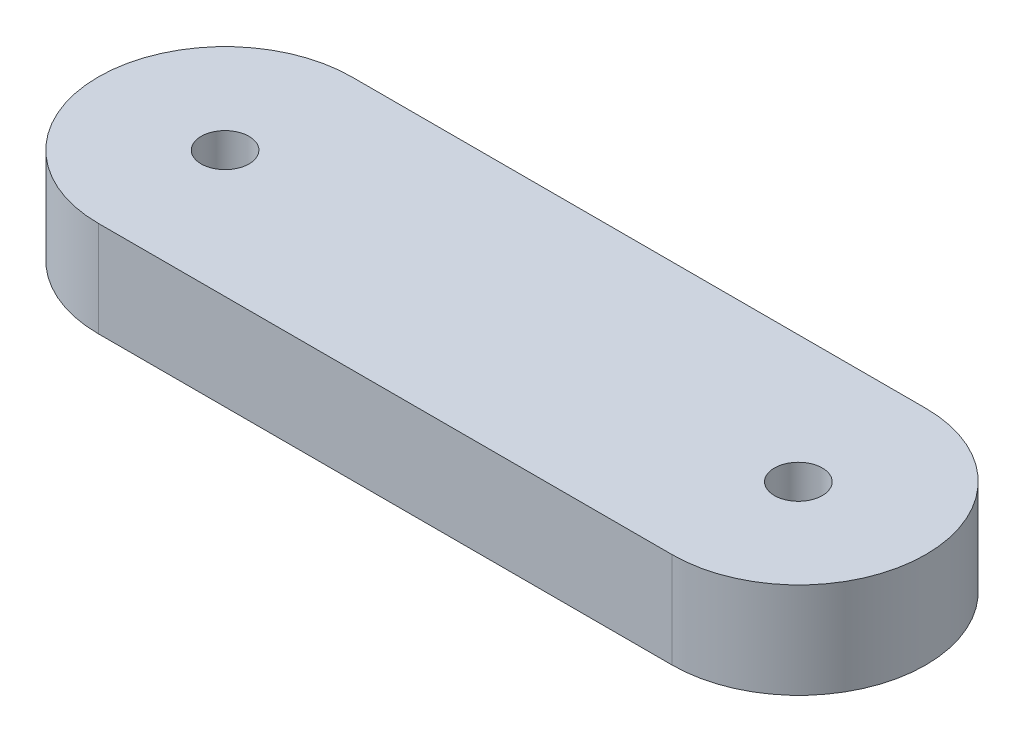
ISO-10303-21;
HEADER;
FILE_DESCRIPTION(('STEP AP214'),'2;1');
FILE_NAME('part.step','',(''),(''),'','','');
FILE_SCHEMA(('AUTOMOTIVE_DESIGN { 1 0 10303 214 1 1 1 1 }'));
ENDSEC;
DATA;
#1=APPLICATION_CONTEXT('core data for automotive mechanical design processes');
#2=APPLICATION_PROTOCOL_DEFINITION('international standard','automotive_design',2000,#1);
#3=PRODUCT_CONTEXT('',#1,'mechanical');
#4=PRODUCT('Part','Part','',(#3));
#5=PRODUCT_RELATED_PRODUCT_CATEGORY('part','',(#4));
#6=PRODUCT_DEFINITION_FORMATION('','',#4);
#7=PRODUCT_DEFINITION_CONTEXT('part definition',#1,'design');
#8=PRODUCT_DEFINITION('design','',#6,#7);
#9=PRODUCT_DEFINITION_SHAPE('','',#8);
#10=(LENGTH_UNIT() NAMED_UNIT(*) SI_UNIT(.MILLI.,.METRE.));
#11=(NAMED_UNIT(*) PLANE_ANGLE_UNIT() SI_UNIT($,.RADIAN.));
#12=(NAMED_UNIT(*) SI_UNIT($,.STERADIAN.) SOLID_ANGLE_UNIT());
#13=UNCERTAINTY_MEASURE_WITH_UNIT(LENGTH_MEASURE(1.E-05),#10,'distance_accuracy_value','');
#14=(GEOMETRIC_REPRESENTATION_CONTEXT(3) GLOBAL_UNCERTAINTY_ASSIGNED_CONTEXT((#13)) GLOBAL_UNIT_ASSIGNED_CONTEXT((#10,
#11,#12)) REPRESENTATION_CONTEXT('',''));
#15=CARTESIAN_POINT('',(0.,0.,0.));
#16=DIRECTION('',(0.,0.,1.));
#17=DIRECTION('',(1.,0.,0.));
#18=AXIS2_PLACEMENT_3D('',#15,#16,#17);
#19=CARTESIAN_POINT('',(-16.4088519542022,6.,6.09914337868322));
#20=DIRECTION('',(0.,1.,0.));
#21=DIRECTION('',(0.,0.,1.));
#22=AXIS2_PLACEMENT_3D('',#19,#20,#21);
#23=PLANE('',#22);
#24=CARTESIAN_POINT('',(19.5911296930118,6.,6.13549444815868));
#25=DIRECTION('',(0.,1.,0.));
#26=DIRECTION('',(0.,0.,1.));
#27=AXIS2_PLACEMENT_3D('',#24,#25,#26);
#28=CIRCLE('',#27,1.50185606528052);
#29=CARTESIAN_POINT('',(19.5911296930118,6.,7.6373505134392));
#30=VERTEX_POINT('',#29);
#31=EDGE_CURVE('E102',#30,#30,#28,.T.);
#32=ORIENTED_EDGE('',*,*,#31,.F.);
#33=EDGE_LOOP('',(#32));
#34=FACE_BOUND('',#33,.T.);
#35=CARTESIAN_POINT('',(-16.4088519542022,6.,6.09914337868322));
#36=DIRECTION('',(0.,1.,0.));
#37=DIRECTION('',(0.,0.,1.));
#38=AXIS2_PLACEMENT_3D('',#35,#36,#37);
#39=CIRCLE('',#38,7.95432054276186);
#40=CARTESIAN_POINT('',(-16.4088519542022,6.,-1.85517716407875));
#41=VERTEX_POINT('',#40);
#42=CARTESIAN_POINT('',(-16.4088519542022,6.,14.053463921445));
#43=VERTEX_POINT('',#42);
#44=EDGE_CURVE('E87',#41,#43,#39,.T.);
#45=ORIENTED_EDGE('',*,*,#44,.T.);
#46=DIRECTION('',(1.,0.,0.));
#47=VECTOR('',#46,1.);
#48=CARTESIAN_POINT('',(-16.4088519542022,6.,14.053463921445));
#49=LINE('',#48,#47);
#50=CARTESIAN_POINT('',(19.5911480447954,6.,14.053463921445));
#51=VERTEX_POINT('',#50);
#52=EDGE_CURVE('E82',#43,#51,#49,.T.);
#53=ORIENTED_EDGE('',*,*,#52,.T.);
#54=CARTESIAN_POINT('',(19.5911480447954,6.,6.09927770648704));
#55=DIRECTION('',(0.,1.,0.));
#56=DIRECTION('',(0.,0.,1.));
#57=AXIS2_PLACEMENT_3D('',#54,#55,#56);
#58=CIRCLE('',#57,7.95418621495793);
#59=CARTESIAN_POINT('',(19.5911480447954,6.,-1.85490850847089));
#60=VERTEX_POINT('',#59);
#61=EDGE_CURVE('E85',#51,#60,#58,.T.);
#62=ORIENTED_EDGE('',*,*,#61,.T.);
#63=DIRECTION('',(-0.999999999972154,0.,-7.46265577382822E-06));
#64=VECTOR('',#63,1.);
#65=CARTESIAN_POINT('',(-16.4088519542022,6.,-1.85517716407875));
#66=LINE('',#65,#64);
#67=EDGE_CURVE('E52',#60,#41,#66,.T.);
#68=ORIENTED_EDGE('',*,*,#67,.T.);
#69=EDGE_LOOP('',(#45,#53,#62,#68));
#70=FACE_BOUND('',#69,.T.);
#71=CARTESIAN_POINT('',(-16.4088519542022,6.,6.09914337868322));
#72=DIRECTION('',(0.,1.,0.));
#73=DIRECTION('',(0.,0.,1.));
#74=AXIS2_PLACEMENT_3D('',#71,#72,#73);
#75=CIRCLE('',#74,1.50185606528058);
#76=CARTESIAN_POINT('',(-16.4088519542022,6.,7.6009994439638));
#77=VERTEX_POINT('',#76);
#78=EDGE_CURVE('E117',#77,#77,#75,.T.);
#79=ORIENTED_EDGE('',*,*,#78,.F.);
#80=EDGE_LOOP('',(#79));
#81=FACE_BOUND('',#80,.T.);
#82=ADVANCED_FACE('F35',(#34,#70,#81),#23,.T.);
#83=CARTESIAN_POINT('',(-16.4088519542022,0.,6.09914337868322));
#84=DIRECTION('',(0.,1.,0.));
#85=DIRECTION('',(0.,0.,1.));
#86=AXIS2_PLACEMENT_3D('',#83,#84,#85);
#87=PLANE('',#86);
#88=CARTESIAN_POINT('',(-16.4088519542022,0.,6.09914337868322));
#89=DIRECTION('',(0.,1.,0.));
#90=DIRECTION('',(0.,0.,1.));
#91=AXIS2_PLACEMENT_3D('',#88,#89,#90);
#92=CIRCLE('',#91,7.95432054276186);
#93=CARTESIAN_POINT('',(-16.4088519542022,0.,-1.85517716407875));
#94=VERTEX_POINT('',#93);
#95=CARTESIAN_POINT('',(-16.4088519542022,0.,14.053463921445));
#96=VERTEX_POINT('',#95);
#97=EDGE_CURVE('E99',#94,#96,#92,.T.);
#98=ORIENTED_EDGE('',*,*,#97,.F.);
#99=DIRECTION('',(-0.999999999972154,0.,-7.46265577382822E-06));
#100=VECTOR('',#99,1.);
#101=CARTESIAN_POINT('',(-16.4088519542022,0.,-1.85517716407875));
#102=LINE('',#101,#100);
#103=CARTESIAN_POINT('',(19.5911480447954,0.,-1.85490850847089));
#104=VERTEX_POINT('',#103);
#105=EDGE_CURVE('E75',#104,#94,#102,.T.);
#106=ORIENTED_EDGE('',*,*,#105,.F.);
#107=CARTESIAN_POINT('',(19.5911480447954,0.,6.09927770648704));
#108=DIRECTION('',(0.,1.,0.));
#109=DIRECTION('',(0.,0.,1.));
#110=AXIS2_PLACEMENT_3D('',#107,#108,#109);
#111=CIRCLE('',#110,7.95418621495793);
#112=CARTESIAN_POINT('',(19.5911480447954,0.,14.053463921445));
#113=VERTEX_POINT('',#112);
#114=EDGE_CURVE('E69',#113,#104,#111,.T.);
#115=ORIENTED_EDGE('',*,*,#114,.F.);
#116=DIRECTION('',(1.,0.,0.));
#117=VECTOR('',#116,1.);
#118=CARTESIAN_POINT('',(-16.4088519542022,0.,14.053463921445));
#119=LINE('',#118,#117);
#120=EDGE_CURVE('E91',#96,#113,#119,.T.);
#121=ORIENTED_EDGE('',*,*,#120,.F.);
#122=EDGE_LOOP('',(#98,#106,#115,#121));
#123=FACE_BOUND('',#122,.T.);
#124=CARTESIAN_POINT('',(19.5911296930118,0.,6.13549444815868));
#125=DIRECTION('',(0.,1.,0.));
#126=DIRECTION('',(0.,0.,1.));
#127=AXIS2_PLACEMENT_3D('',#124,#125,#126);
#128=CIRCLE('',#127,1.50185606528052);
#129=CARTESIAN_POINT('',(19.5911296930118,0.,7.6373505134392));
#130=VERTEX_POINT('',#129);
#131=EDGE_CURVE('E114',#130,#130,#128,.T.);
#132=ORIENTED_EDGE('',*,*,#131,.T.);
#133=EDGE_LOOP('',(#132));
#134=FACE_BOUND('',#133,.T.);
#135=CARTESIAN_POINT('',(-16.4088519542022,0.,6.09914337868322));
#136=DIRECTION('',(0.,1.,0.));
#137=DIRECTION('',(0.,0.,1.));
#138=AXIS2_PLACEMENT_3D('',#135,#136,#137);
#139=CIRCLE('',#138,1.50185606528058);
#140=CARTESIAN_POINT('',(-16.4088519542022,0.,7.6009994439638));
#141=VERTEX_POINT('',#140);
#142=EDGE_CURVE('E120',#141,#141,#139,.T.);
#143=ORIENTED_EDGE('',*,*,#142,.T.);
#144=EDGE_LOOP('',(#143));
#145=FACE_BOUND('',#144,.T.);
#146=ADVANCED_FACE('F110',(#123,#134,#145),#87,.F.);
#147=CARTESIAN_POINT('',(-16.4088519542022,6.,6.09914337868322));
#148=DIRECTION('',(0.,-1.,0.));
#149=DIRECTION('',(0.,0.,-1.));
#150=AXIS2_PLACEMENT_3D('',#147,#148,#149);
#151=CYLINDRICAL_SURFACE('',#150,7.95432054276186);
#152=ORIENTED_EDGE('',*,*,#97,.T.);
#153=DIRECTION('',(0.,-1.,0.));
#154=VECTOR('',#153,1.);
#155=CARTESIAN_POINT('',(-16.4088519542022,6.,14.053463921445));
#156=LINE('',#155,#154);
#157=EDGE_CURVE('E11',#43,#96,#156,.T.);
#158=ORIENTED_EDGE('',*,*,#157,.F.);
#159=ORIENTED_EDGE('',*,*,#44,.F.);
#160=DIRECTION('',(0.,-1.,0.));
#161=VECTOR('',#160,1.);
#162=CARTESIAN_POINT('',(-16.4088519542022,6.,-1.85517716407875));
#163=LINE('',#162,#161);
#164=EDGE_CURVE('E95',#41,#94,#163,.T.);
#165=ORIENTED_EDGE('',*,*,#164,.T.);
#166=EDGE_LOOP('',(#152,#158,#159,#165));
#167=FACE_BOUND('',#166,.T.);
#168=ADVANCED_FACE('F37',(#167),#151,.T.);
#169=CARTESIAN_POINT('',(-16.4088519542022,6.,14.053463921445));
#170=DIRECTION('',(0.,0.,-1.));
#171=DIRECTION('',(-1.,0.,0.));
#172=AXIS2_PLACEMENT_3D('',#169,#170,#171);
#173=PLANE('',#172);
#174=ORIENTED_EDGE('',*,*,#120,.T.);
#175=DIRECTION('',(0.,-1.,0.));
#176=VECTOR('',#175,1.);
#177=CARTESIAN_POINT('',(19.5911480447954,6.,14.053463921445));
#178=LINE('',#177,#176);
#179=EDGE_CURVE('E44',#51,#113,#178,.T.);
#180=ORIENTED_EDGE('',*,*,#179,.F.);
#181=ORIENTED_EDGE('',*,*,#52,.F.);
#182=ORIENTED_EDGE('',*,*,#157,.T.);
#183=EDGE_LOOP('',(#174,#180,#181,#182));
#184=FACE_BOUND('',#183,.T.);
#185=ADVANCED_FACE('F90',(#184),#173,.F.);
#186=CARTESIAN_POINT('',(19.5911480447954,6.,6.09927770648704));
#187=DIRECTION('',(0.,-1.,0.));
#188=DIRECTION('',(0.,0.,-1.));
#189=AXIS2_PLACEMENT_3D('',#186,#187,#188);
#190=CYLINDRICAL_SURFACE('',#189,7.95418621495793);
#191=ORIENTED_EDGE('',*,*,#114,.T.);
#192=DIRECTION('',(0.,-1.,0.));
#193=VECTOR('',#192,1.);
#194=CARTESIAN_POINT('',(19.5911480447954,6.,-1.85490850847089));
#195=LINE('',#194,#193);
#196=EDGE_CURVE('E92',#60,#104,#195,.T.);
#197=ORIENTED_EDGE('',*,*,#196,.F.);
#198=ORIENTED_EDGE('',*,*,#61,.F.);
#199=ORIENTED_EDGE('',*,*,#179,.T.);
#200=EDGE_LOOP('',(#191,#197,#198,#199));
#201=FACE_BOUND('',#200,.T.);
#202=ADVANCED_FACE('F93',(#201),#190,.T.);
#203=CARTESIAN_POINT('',(-16.4088519542022,6.,-1.85517716407875));
#204=DIRECTION('',(-7.46265577382821E-06,0.,0.999999999972154));
#205=DIRECTION('',(0.999999999972154,0.,7.46265577382822E-06));
#206=AXIS2_PLACEMENT_3D('',#203,#204,#205);
#207=PLANE('',#206);
#208=ORIENTED_EDGE('',*,*,#105,.T.);
#209=ORIENTED_EDGE('',*,*,#164,.F.);
#210=ORIENTED_EDGE('',*,*,#67,.F.);
#211=ORIENTED_EDGE('',*,*,#196,.T.);
#212=EDGE_LOOP('',(#208,#209,#210,#211));
#213=FACE_BOUND('',#212,.T.);
#214=ADVANCED_FACE('F107',(#213),#207,.F.);
#215=CARTESIAN_POINT('',(19.5911296930118,6.,6.13549444815868));
#216=DIRECTION('',(0.,-1.,0.));
#217=DIRECTION('',(0.,0.,-1.));
#218=AXIS2_PLACEMENT_3D('',#215,#216,#217);
#219=CYLINDRICAL_SURFACE('',#218,1.50185606528052);
#220=ORIENTED_EDGE('',*,*,#31,.T.);
#221=EDGE_LOOP('',(#220));
#222=FACE_BOUND('',#221,.T.);
#223=ORIENTED_EDGE('',*,*,#131,.F.);
#224=EDGE_LOOP('',(#223));
#225=FACE_BOUND('',#224,.T.);
#226=ADVANCED_FACE('F137',(#222,#225),#219,.F.);
#227=CARTESIAN_POINT('',(-16.4088519542022,6.,6.09914337868322));
#228=DIRECTION('',(0.,-1.,0.));
#229=DIRECTION('',(0.,0.,-1.));
#230=AXIS2_PLACEMENT_3D('',#227,#228,#229);
#231=CYLINDRICAL_SURFACE('',#230,1.50185606528058);
#232=ORIENTED_EDGE('',*,*,#78,.T.);
#233=EDGE_LOOP('',(#232));
#234=FACE_BOUND('',#233,.T.);
#235=ORIENTED_EDGE('',*,*,#142,.F.);
#236=EDGE_LOOP('',(#235));
#237=FACE_BOUND('',#236,.T.);
#238=ADVANCED_FACE('F126',(#234,#237),#231,.F.);
#239=CLOSED_SHELL('',(#82,#146,#168,#185,#202,#214,#226,#238));
#240=MANIFOLD_SOLID_BREP('B2',#239);
#241=ADVANCED_BREP_SHAPE_REPRESENTATION('',(#18,#240),#14);
#242=SHAPE_DEFINITION_REPRESENTATION(#9,#241);
ENDSEC;
END-ISO-10303-21;
